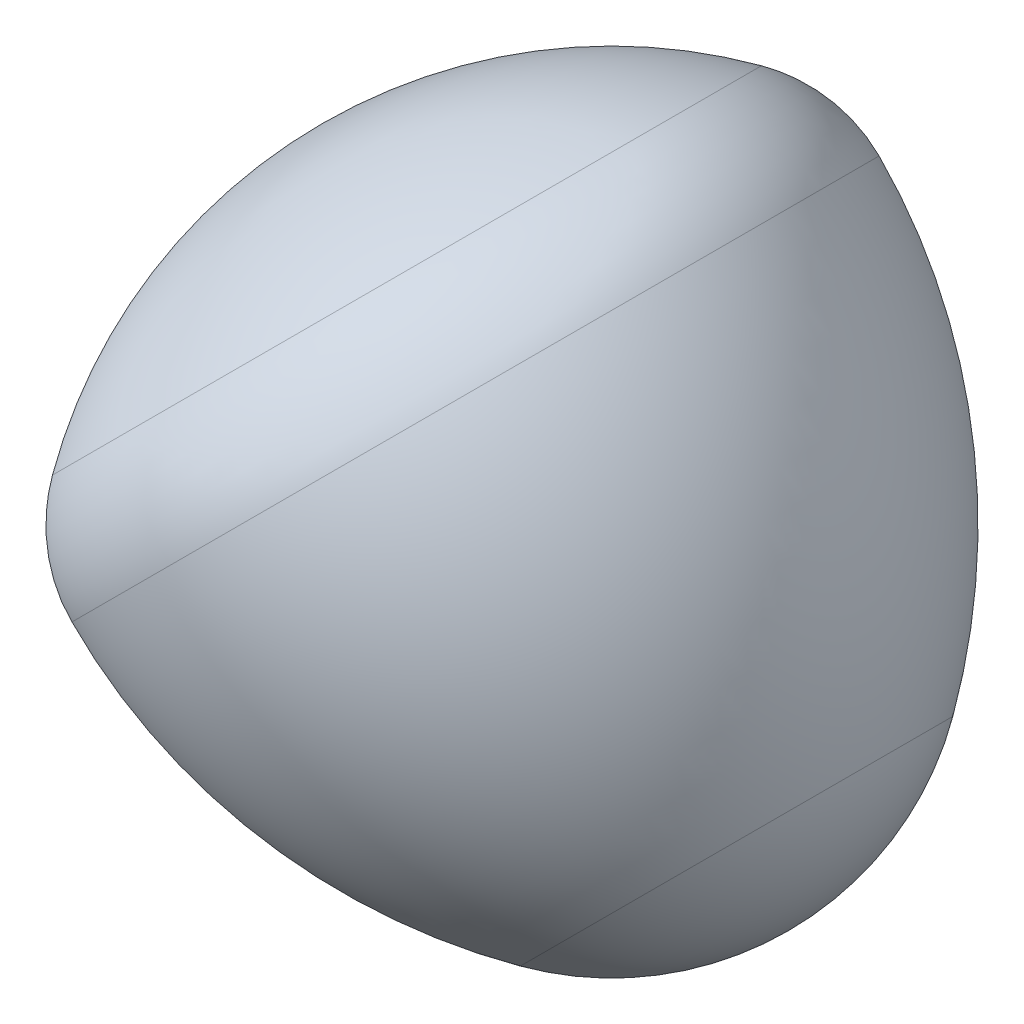
ISO-10303-21;
HEADER;
FILE_DESCRIPTION(('STEP AP214'),'2;1');
FILE_NAME('part.step','',(''),(''),'','','');
FILE_SCHEMA(('AUTOMOTIVE_DESIGN { 1 0 10303 214 1 1 1 1 }'));
ENDSEC;
DATA;
#1=APPLICATION_CONTEXT('core data for automotive mechanical design processes');
#2=APPLICATION_PROTOCOL_DEFINITION('international standard','automotive_design',2000,#1);
#3=PRODUCT_CONTEXT('',#1,'mechanical');
#4=PRODUCT('Part','Part','',(#3));
#5=PRODUCT_RELATED_PRODUCT_CATEGORY('part','',(#4));
#6=PRODUCT_DEFINITION_FORMATION('','',#4);
#7=PRODUCT_DEFINITION_CONTEXT('part definition',#1,'design');
#8=PRODUCT_DEFINITION('design','',#6,#7);
#9=PRODUCT_DEFINITION_SHAPE('','',#8);
#10=(LENGTH_UNIT() NAMED_UNIT(*) SI_UNIT(.MILLI.,.METRE.));
#11=(NAMED_UNIT(*) PLANE_ANGLE_UNIT() SI_UNIT($,.RADIAN.));
#12=(NAMED_UNIT(*) SI_UNIT($,.STERADIAN.) SOLID_ANGLE_UNIT());
#13=UNCERTAINTY_MEASURE_WITH_UNIT(LENGTH_MEASURE(1.E-05),#10,'distance_accuracy_value','');
#14=(GEOMETRIC_REPRESENTATION_CONTEXT(3) GLOBAL_UNCERTAINTY_ASSIGNED_CONTEXT((#13)) GLOBAL_UNIT_ASSIGNED_CONTEXT((#10,
#11,#12)) REPRESENTATION_CONTEXT('',''));
#15=CARTESIAN_POINT('',(0.,0.,0.));
#16=DIRECTION('',(0.,0.,1.));
#17=DIRECTION('',(1.,0.,0.));
#18=AXIS2_PLACEMENT_3D('',#15,#16,#17);
#19=CARTESIAN_POINT('',(-2.8858986007934,2.88589860079341,0.));
#20=DIRECTION('',(-0.707106781186546,0.707106781186549,0.));
#21=DIRECTION('',(-0.707106781186549,-0.707106781186546,0.));
#22=AXIS2_PLACEMENT_3D('',#19,#20,#21);
#23=SPHERICAL_SURFACE('',#22,9.47388617849794);
#24=CARTESIAN_POINT('',(1.85104448845552,-1.8510444884555,0.));
#25=DIRECTION('',(-0.707106781186546,0.707106781186549,0.));
#26=DIRECTION('',(-0.707106781186549,-0.707106781186546,0.));
#27=AXIS2_PLACEMENT_3D('',#24,#25,#26);
#28=CIRCLE('',#27,6.69904916100534);
#29=CARTESIAN_POINT('',(-2.88589860079341,-6.58798757770442,0.));
#30=VERTEX_POINT('',#29);
#31=EDGE_CURVE('E44',#30,#30,#28,.T.);
#32=ORIENTED_EDGE('',*,*,#31,.F.);
#33=EDGE_LOOP('',(#32));
#34=FACE_BOUND('',#33,.T.);
#35=ADVANCED_FACE('F34',(#34),#23,.T.);
#36=CARTESIAN_POINT('',(-2.8858986007934,2.88589860079341,0.));
#37=DIRECTION('',(-0.707106781186546,0.707106781186549,0.));
#38=DIRECTION('',(0.707106781186549,0.707106781186546,0.));
#39=AXIS2_PLACEMENT_3D('',#36,#37,#38);
#40=SPHERICAL_SURFACE('',#39,15.5261138215021);
#41=CARTESIAN_POINT('',(-10.6489555115445,10.6489555115445,0.));
#42=DIRECTION('',(-0.707106781186546,0.707106781186549,0.));
#43=DIRECTION('',(-0.707106781186549,-0.707106781186546,0.));
#44=AXIS2_PLACEMENT_3D('',#41,#42,#43);
#45=CIRCLE('',#44,10.9786203686583);
#46=CARTESIAN_POINT('',(-18.4120124222955,2.88589860079347,0.));
#47=VERTEX_POINT('',#46);
#48=EDGE_CURVE('E10',#47,#47,#45,.T.);
#49=ORIENTED_EDGE('',*,*,#48,.T.);
#50=EDGE_LOOP('',(#49));
#51=FACE_BOUND('',#50,.T.);
#52=ADVANCED_FACE('F54',(#51),#40,.T.);
#53=CARTESIAN_POINT('',(-8.05179802612218,8.05179802612222,0.));
#54=DIRECTION('',(-0.707106781186546,0.707106781186549,0.));
#55=DIRECTION('',(-0.707106781186549,-0.707106781186546,0.));
#56=AXIS2_PLACEMENT_3D('',#53,#54,#55);
#57=TOROIDAL_SURFACE('',#56,7.30568502915533,5.19431497084457);
#58=ORIENTED_EDGE('',*,*,#48,.F.);
#59=EDGE_LOOP('',(#58));
#60=FACE_BOUND('',#59,.T.);
#61=CARTESIAN_POINT('',(-8.05179802612185,8.05179802612189,0.));
#62=DIRECTION('',(-0.707106781186546,0.707106781186549,0.));
#63=DIRECTION('',(-0.707106781186549,-0.707106781186546,0.));
#64=AXIS2_PLACEMENT_3D('',#61,#62,#63);
#65=CIRCLE('',#64,12.4999999999999);
#66=CARTESIAN_POINT('',(-16.8906327909536,-0.787036738709872,0.));
#67=VERTEX_POINT('',#66);
#68=EDGE_CURVE('E40',#67,#67,#65,.T.);
#69=ORIENTED_EDGE('',*,*,#68,.T.);
#70=EDGE_LOOP('',(#69));
#71=FACE_BOUND('',#70,.T.);
#72=ADVANCED_FACE('F58',(#60,#71),#57,.T.);
#73=CARTESIAN_POINT('',(-8.05179802612223,8.05179802612227,0.));
#74=DIRECTION('',(-0.707106781186546,0.707106781186549,0.));
#75=DIRECTION('',(-0.707106781186549,-0.707106781186546,0.));
#76=AXIS2_PLACEMENT_3D('',#73,#74,#75);
#77=DEGENERATE_TOROIDAL_SURFACE('',#76,7.30568502915546,19.8056850291555,.F.);
#78=ORIENTED_EDGE('',*,*,#68,.F.);
#79=EDGE_LOOP('',(#78));
#80=FACE_BOUND('',#79,.T.);
#81=ORIENTED_EDGE('',*,*,#31,.T.);
#82=EDGE_LOOP('',(#81));
#83=FACE_BOUND('',#82,.T.);
#84=ADVANCED_FACE('F51',(#80,#83),#77,.F.);
#85=CLOSED_SHELL('',(#35,#52,#72,#84));
#86=MANIFOLD_SOLID_BREP('B2',#85);
#87=ADVANCED_BREP_SHAPE_REPRESENTATION('',(#18,#86),#14);
#88=SHAPE_DEFINITION_REPRESENTATION(#9,#87);
ENDSEC;
END-ISO-10303-21;
